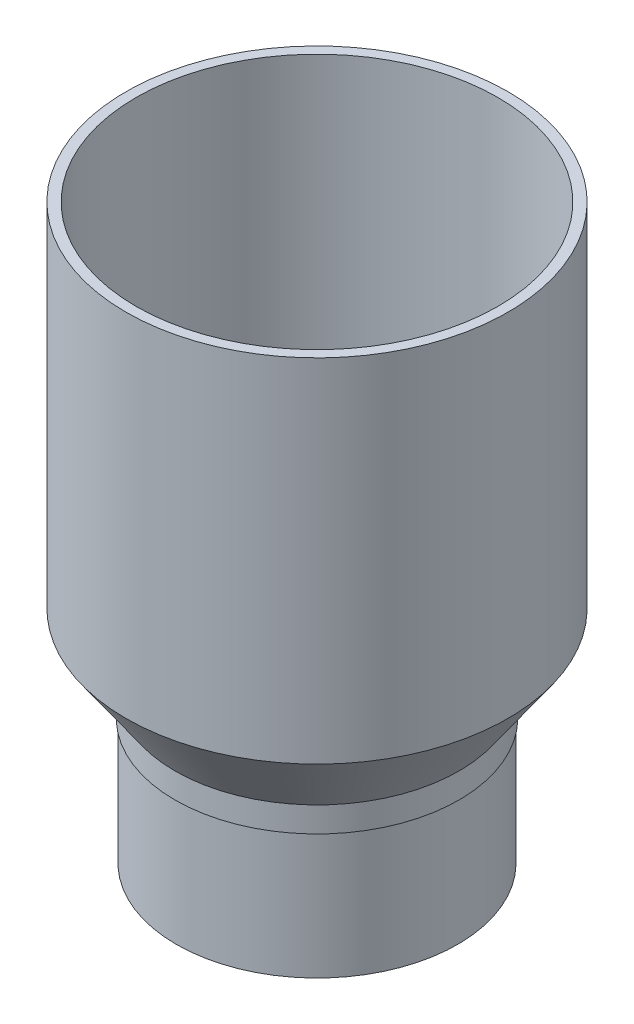
ISO-10303-21;
HEADER;
FILE_DESCRIPTION(('STEP AP214'),'2;1');
FILE_NAME('part.step','',(''),(''),'','','');
FILE_SCHEMA(('AUTOMOTIVE_DESIGN { 1 0 10303 214 1 1 1 1 }'));
ENDSEC;
DATA;
#1=APPLICATION_CONTEXT('core data for automotive mechanical design processes');
#2=APPLICATION_PROTOCOL_DEFINITION('international standard','automotive_design',2000,#1);
#3=PRODUCT_CONTEXT('',#1,'mechanical');
#4=PRODUCT('Part','Part','',(#3));
#5=PRODUCT_RELATED_PRODUCT_CATEGORY('part','',(#4));
#6=PRODUCT_DEFINITION_FORMATION('','',#4);
#7=PRODUCT_DEFINITION_CONTEXT('part definition',#1,'design');
#8=PRODUCT_DEFINITION('design','',#6,#7);
#9=PRODUCT_DEFINITION_SHAPE('','',#8);
#10=(LENGTH_UNIT() NAMED_UNIT(*) SI_UNIT(.MILLI.,.METRE.));
#11=(NAMED_UNIT(*) PLANE_ANGLE_UNIT() SI_UNIT($,.RADIAN.));
#12=(NAMED_UNIT(*) SI_UNIT($,.STERADIAN.) SOLID_ANGLE_UNIT());
#13=UNCERTAINTY_MEASURE_WITH_UNIT(LENGTH_MEASURE(1.E-05),#10,'distance_accuracy_value','');
#14=(GEOMETRIC_REPRESENTATION_CONTEXT(3) GLOBAL_UNCERTAINTY_ASSIGNED_CONTEXT((#13)) GLOBAL_UNIT_ASSIGNED_CONTEXT((#10,
#11,#12)) REPRESENTATION_CONTEXT('',''));
#15=CARTESIAN_POINT('',(0.,0.,0.));
#16=DIRECTION('',(0.,0.,1.));
#17=DIRECTION('',(1.,0.,0.));
#18=AXIS2_PLACEMENT_3D('',#15,#16,#17);
#19=CARTESIAN_POINT('',(36.,75.1537903680847,0.));
#20=DIRECTION('',(0.,-1.,0.));
#21=DIRECTION('',(0.,0.,-1.));
#22=AXIS2_PLACEMENT_3D('',#19,#20,#21);
#23=PLANE('',#22);
#24=CARTESIAN_POINT('',(0.,75.1537903680847,0.));
#25=DIRECTION('',(0.,1.,0.));
#26=DIRECTION('',(0.,0.,1.));
#27=AXIS2_PLACEMENT_3D('',#24,#25,#26);
#28=CIRCLE('',#27,36.);
#29=CARTESIAN_POINT('',(0.,75.1537903680847,36.));
#30=VERTEX_POINT('',#29);
#31=EDGE_CURVE('E77',#30,#30,#28,.T.);
#32=ORIENTED_EDGE('',*,*,#31,.F.);
#33=EDGE_LOOP('',(#32));
#34=FACE_BOUND('',#33,.T.);
#35=CARTESIAN_POINT('',(0.,75.1537903680847,0.));
#36=DIRECTION('',(0.,1.,0.));
#37=DIRECTION('',(0.,0.,1.));
#38=AXIS2_PLACEMENT_3D('',#35,#36,#37);
#39=CIRCLE('',#38,38.);
#40=CARTESIAN_POINT('',(0.,75.1537903680847,38.));
#41=VERTEX_POINT('',#40);
#42=EDGE_CURVE('E10',#41,#41,#39,.T.);
#43=ORIENTED_EDGE('',*,*,#42,.T.);
#44=EDGE_LOOP('',(#43));
#45=FACE_BOUND('',#44,.T.);
#46=ADVANCED_FACE('F37',(#34,#45),#23,.F.);
#47=CARTESIAN_POINT('',(0.,88.7744700527819,0.));
#48=DIRECTION('',(0.,1.,0.));
#49=DIRECTION('',(0.,0.,1.));
#50=AXIS2_PLACEMENT_3D('',#47,#48,#49);
#51=CYLINDRICAL_SURFACE('',#50,38.);
#52=ORIENTED_EDGE('',*,*,#42,.F.);
#53=EDGE_LOOP('',(#52));
#54=FACE_BOUND('',#53,.T.);
#55=CARTESIAN_POINT('',(0.,5.15379036808471,0.));
#56=DIRECTION('',(0.,1.,0.));
#57=DIRECTION('',(0.,0.,1.));
#58=AXIS2_PLACEMENT_3D('',#55,#56,#57);
#59=CIRCLE('',#58,38.);
#60=CARTESIAN_POINT('',(0.,5.15379036808471,38.));
#61=VERTEX_POINT('',#60);
#62=EDGE_CURVE('E43',#61,#61,#59,.T.);
#63=ORIENTED_EDGE('',*,*,#62,.T.);
#64=EDGE_LOOP('',(#63));
#65=FACE_BOUND('',#64,.T.);
#66=ADVANCED_FACE('F84',(#54,#65),#51,.T.);
#67=CARTESIAN_POINT('',(0.,-8.77179438482814,0.));
#68=DIRECTION('',(0.,1.,0.));
#69=DIRECTION('',(0.,0.,1.));
#70=AXIS2_PLACEMENT_3D('',#67,#68,#69);
#71=CONICAL_SURFACE('',#70,28.2492005820322,0.610865238198017);
#72=ORIENTED_EDGE('',*,*,#62,.F.);
#73=EDGE_LOOP('',(#72));
#74=FACE_BOUND('',#73,.T.);
#75=CARTESIAN_POINT('',(0.,-8.77179438482814,0.));
#76=DIRECTION('',(0.,1.,0.));
#77=DIRECTION('',(0.,0.,1.));
#78=AXIS2_PLACEMENT_3D('',#75,#76,#77);
#79=CIRCLE('',#78,28.2492005820322);
#80=CARTESIAN_POINT('',(0.,-8.77179438482814,28.2492005820322));
#81=VERTEX_POINT('',#80);
#82=EDGE_CURVE('E47',#81,#81,#79,.T.);
#83=ORIENTED_EDGE('',*,*,#82,.T.);
#84=EDGE_LOOP('',(#83));
#85=FACE_BOUND('',#84,.T.);
#86=ADVANCED_FACE('F88',(#74,#85),#71,.T.);
#87=CARTESIAN_POINT('',(0.,88.7744700527819,0.));
#88=DIRECTION('',(0.,1.,0.));
#89=DIRECTION('',(0.,0.,1.));
#90=AXIS2_PLACEMENT_3D('',#87,#88,#89);
#91=CYLINDRICAL_SURFACE('',#90,28.2492005820322);
#92=ORIENTED_EDGE('',*,*,#82,.F.);
#93=EDGE_LOOP('',(#92));
#94=FACE_BOUND('',#93,.T.);
#95=CARTESIAN_POINT('',(0.,-13.7717943848281,0.));
#96=DIRECTION('',(0.,1.,0.));
#97=DIRECTION('',(0.,0.,1.));
#98=AXIS2_PLACEMENT_3D('',#95,#96,#97);
#99=CIRCLE('',#98,28.2492005820322);
#100=CARTESIAN_POINT('',(0.,-13.7717943848281,28.2492005820322));
#101=VERTEX_POINT('',#100);
#102=EDGE_CURVE('E51',#101,#101,#99,.T.);
#103=ORIENTED_EDGE('',*,*,#102,.T.);
#104=EDGE_LOOP('',(#103));
#105=FACE_BOUND('',#104,.T.);
#106=ADVANCED_FACE('F93',(#94,#105),#91,.T.);
#107=CARTESIAN_POINT('',(28.2492005820322,-13.7717943848281,0.));
#108=DIRECTION('',(0.,1.,0.));
#109=DIRECTION('',(0.,0.,1.));
#110=AXIS2_PLACEMENT_3D('',#107,#108,#109);
#111=PLANE('',#110);
#112=ORIENTED_EDGE('',*,*,#102,.F.);
#113=EDGE_LOOP('',(#112));
#114=FACE_BOUND('',#113,.T.);
#115=CARTESIAN_POINT('',(0.,-13.7717943848281,0.));
#116=DIRECTION('',(0.,1.,0.));
#117=DIRECTION('',(0.,0.,1.));
#118=AXIS2_PLACEMENT_3D('',#115,#116,#117);
#119=CIRCLE('',#118,28.);
#120=CARTESIAN_POINT('',(0.,-13.7717943848281,28.));
#121=VERTEX_POINT('',#120);
#122=EDGE_CURVE('E56',#121,#121,#119,.T.);
#123=ORIENTED_EDGE('',*,*,#122,.T.);
#124=EDGE_LOOP('',(#123));
#125=FACE_BOUND('',#124,.T.);
#126=ADVANCED_FACE('F99',(#114,#125),#111,.F.);
#127=CARTESIAN_POINT('',(0.,88.7744700527819,0.));
#128=DIRECTION('',(0.,1.,0.));
#129=DIRECTION('',(0.,0.,1.));
#130=AXIS2_PLACEMENT_3D('',#127,#128,#129);
#131=CYLINDRICAL_SURFACE('',#130,28.);
#132=ORIENTED_EDGE('',*,*,#122,.F.);
#133=EDGE_LOOP('',(#132));
#134=FACE_BOUND('',#133,.T.);
#135=CARTESIAN_POINT('',(0.,-38.7717943848282,0.));
#136=DIRECTION('',(0.,1.,0.));
#137=DIRECTION('',(0.,0.,1.));
#138=AXIS2_PLACEMENT_3D('',#135,#136,#137);
#139=CIRCLE('',#138,28.);
#140=CARTESIAN_POINT('',(0.,-38.7717943848282,28.));
#141=VERTEX_POINT('',#140);
#142=EDGE_CURVE('E59',#141,#141,#139,.T.);
#143=ORIENTED_EDGE('',*,*,#142,.T.);
#144=EDGE_LOOP('',(#143));
#145=FACE_BOUND('',#144,.T.);
#146=ADVANCED_FACE('F103',(#134,#145),#131,.T.);
#147=CARTESIAN_POINT('',(26.,-38.7717943848281,0.));
#148=DIRECTION('',(0.,1.,0.));
#149=DIRECTION('',(0.,0.,1.));
#150=AXIS2_PLACEMENT_3D('',#147,#148,#149);
#151=PLANE('',#150);
#152=ORIENTED_EDGE('',*,*,#142,.F.);
#153=EDGE_LOOP('',(#152));
#154=FACE_BOUND('',#153,.T.);
#155=CARTESIAN_POINT('',(0.,-38.7717943848282,0.));
#156=DIRECTION('',(0.,1.,0.));
#157=DIRECTION('',(0.,0.,1.));
#158=AXIS2_PLACEMENT_3D('',#155,#156,#157);
#159=CIRCLE('',#158,26.);
#160=CARTESIAN_POINT('',(0.,-38.7717943848282,26.));
#161=VERTEX_POINT('',#160);
#162=EDGE_CURVE('E62',#161,#161,#159,.T.);
#163=ORIENTED_EDGE('',*,*,#162,.T.);
#164=EDGE_LOOP('',(#163));
#165=FACE_BOUND('',#164,.T.);
#166=ADVANCED_FACE('F107',(#154,#165),#151,.F.);
#167=CARTESIAN_POINT('',(0.,88.7744700527819,0.));
#168=DIRECTION('',(0.,1.,0.));
#169=DIRECTION('',(0.,0.,1.));
#170=AXIS2_PLACEMENT_3D('',#167,#168,#169);
#171=CYLINDRICAL_SURFACE('',#170,26.);
#172=ORIENTED_EDGE('',*,*,#162,.F.);
#173=EDGE_LOOP('',(#172));
#174=FACE_BOUND('',#173,.T.);
#175=CARTESIAN_POINT('',(0.,-13.7717943848281,0.));
#176=DIRECTION('',(0.,1.,0.));
#177=DIRECTION('',(0.,0.,1.));
#178=AXIS2_PLACEMENT_3D('',#175,#176,#177);
#179=CIRCLE('',#178,26.);
#180=CARTESIAN_POINT('',(0.,-13.7717943848281,26.));
#181=VERTEX_POINT('',#180);
#182=EDGE_CURVE('E65',#181,#181,#179,.T.);
#183=ORIENTED_EDGE('',*,*,#182,.T.);
#184=EDGE_LOOP('',(#183));
#185=FACE_BOUND('',#184,.T.);
#186=ADVANCED_FACE('F111',(#174,#185),#171,.F.);
#187=CARTESIAN_POINT('',(26.2492005820322,-13.7717943848281,0.));
#188=DIRECTION('',(0.,-1.,0.));
#189=DIRECTION('',(0.,0.,-1.));
#190=AXIS2_PLACEMENT_3D('',#187,#188,#189);
#191=PLANE('',#190);
#192=ORIENTED_EDGE('',*,*,#182,.F.);
#193=EDGE_LOOP('',(#192));
#194=FACE_BOUND('',#193,.T.);
#195=CARTESIAN_POINT('',(0.,-13.7717943848281,0.));
#196=DIRECTION('',(0.,1.,0.));
#197=DIRECTION('',(0.,0.,1.));
#198=AXIS2_PLACEMENT_3D('',#195,#196,#197);
#199=CIRCLE('',#198,26.2492005820322);
#200=CARTESIAN_POINT('',(0.,-13.7717943848281,26.2492005820322));
#201=VERTEX_POINT('',#200);
#202=EDGE_CURVE('E68',#201,#201,#199,.T.);
#203=ORIENTED_EDGE('',*,*,#202,.T.);
#204=EDGE_LOOP('',(#203));
#205=FACE_BOUND('',#204,.T.);
#206=ADVANCED_FACE('F115',(#194,#205),#191,.F.);
#207=CARTESIAN_POINT('',(0.,88.7744700527819,0.));
#208=DIRECTION('',(0.,1.,0.));
#209=DIRECTION('',(0.,0.,1.));
#210=AXIS2_PLACEMENT_3D('',#207,#208,#209);
#211=CYLINDRICAL_SURFACE('',#210,26.2492005820322);
#212=ORIENTED_EDGE('',*,*,#202,.F.);
#213=EDGE_LOOP('',(#212));
#214=FACE_BOUND('',#213,.T.);
#215=CARTESIAN_POINT('',(0.,-8.77179438482814,0.));
#216=DIRECTION('',(0.,1.,0.));
#217=DIRECTION('',(0.,0.,1.));
#218=AXIS2_PLACEMENT_3D('',#215,#216,#217);
#219=CIRCLE('',#218,26.2492005820322);
#220=CARTESIAN_POINT('',(0.,-8.77179438482814,26.2492005820322));
#221=VERTEX_POINT('',#220);
#222=EDGE_CURVE('E71',#221,#221,#219,.T.);
#223=ORIENTED_EDGE('',*,*,#222,.T.);
#224=EDGE_LOOP('',(#223));
#225=FACE_BOUND('',#224,.T.);
#226=ADVANCED_FACE('F119',(#214,#225),#211,.F.);
#227=CARTESIAN_POINT('',(0.,5.15379036808471,0.));
#228=DIRECTION('',(0.,1.,0.));
#229=DIRECTION('',(0.,0.,1.));
#230=AXIS2_PLACEMENT_3D('',#227,#228,#229);
#231=CONICAL_SURFACE('',#230,36.,0.610865238198017);
#232=ORIENTED_EDGE('',*,*,#222,.F.);
#233=EDGE_LOOP('',(#232));
#234=FACE_BOUND('',#233,.T.);
#235=CARTESIAN_POINT('',(0.,5.15379036808471,0.));
#236=DIRECTION('',(0.,1.,0.));
#237=DIRECTION('',(0.,0.,1.));
#238=AXIS2_PLACEMENT_3D('',#235,#236,#237);
#239=CIRCLE('',#238,36.);
#240=CARTESIAN_POINT('',(0.,5.15379036808471,36.));
#241=VERTEX_POINT('',#240);
#242=EDGE_CURVE('E74',#241,#241,#239,.T.);
#243=ORIENTED_EDGE('',*,*,#242,.T.);
#244=EDGE_LOOP('',(#243));
#245=FACE_BOUND('',#244,.T.);
#246=ADVANCED_FACE('F123',(#234,#245),#231,.F.);
#247=CARTESIAN_POINT('',(0.,88.7744700527819,0.));
#248=DIRECTION('',(0.,1.,0.));
#249=DIRECTION('',(0.,0.,1.));
#250=AXIS2_PLACEMENT_3D('',#247,#248,#249);
#251=CYLINDRICAL_SURFACE('',#250,36.);
#252=ORIENTED_EDGE('',*,*,#242,.F.);
#253=EDGE_LOOP('',(#252));
#254=FACE_BOUND('',#253,.T.);
#255=ORIENTED_EDGE('',*,*,#31,.T.);
#256=EDGE_LOOP('',(#255));
#257=FACE_BOUND('',#256,.T.);
#258=ADVANCED_FACE('F81',(#254,#257),#251,.F.);
#259=CLOSED_SHELL('',(#46,#66,#86,#106,#126,#146,#166,#186,#206,#226,#246,#258));
#260=MANIFOLD_SOLID_BREP('B2',#259);
#261=ADVANCED_BREP_SHAPE_REPRESENTATION('',(#18,#260),#14);
#262=SHAPE_DEFINITION_REPRESENTATION(#9,#261);
ENDSEC;
END-ISO-10303-21;
